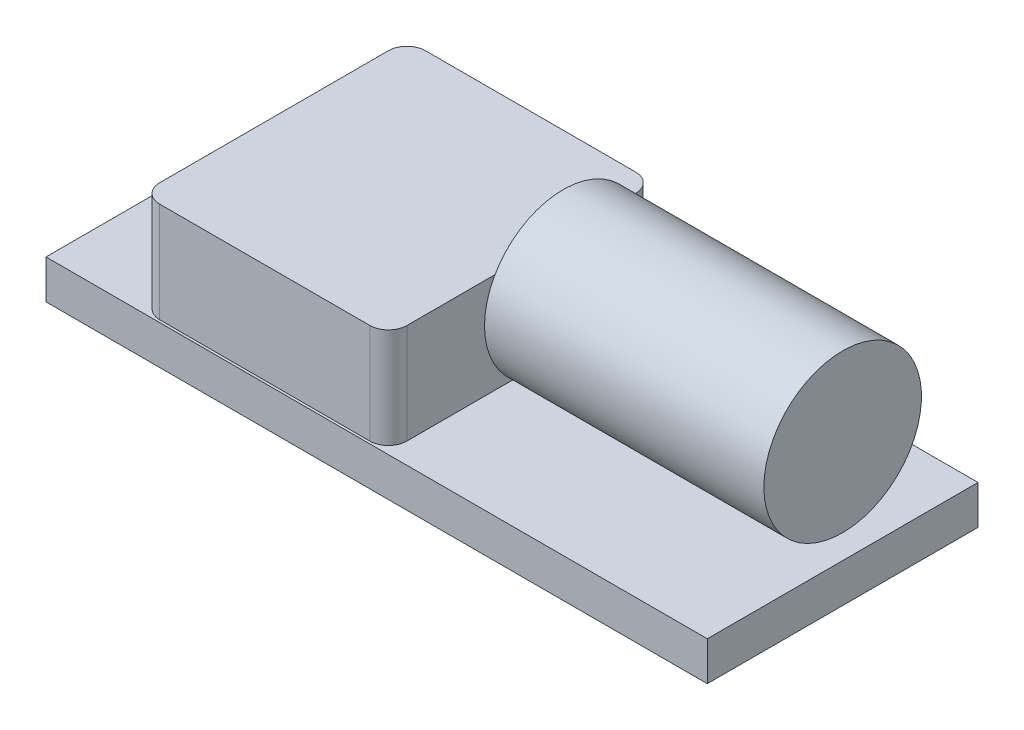
ISO-10303-21;
HEADER;
FILE_DESCRIPTION(('STEP AP214'),'2;1');
FILE_NAME('part.step','',(''),(''),'','','');
FILE_SCHEMA(('AUTOMOTIVE_DESIGN { 1 0 10303 214 1 1 1 1 }'));
ENDSEC;
DATA;
#1=APPLICATION_CONTEXT('core data for automotive mechanical design processes');
#2=APPLICATION_PROTOCOL_DEFINITION('international standard','automotive_design',2000,#1);
#3=PRODUCT_CONTEXT('',#1,'mechanical');
#4=PRODUCT('Part','Part','',(#3));
#5=PRODUCT_RELATED_PRODUCT_CATEGORY('part','',(#4));
#6=PRODUCT_DEFINITION_FORMATION('','',#4);
#7=PRODUCT_DEFINITION_CONTEXT('part definition',#1,'design');
#8=PRODUCT_DEFINITION('design','',#6,#7);
#9=PRODUCT_DEFINITION_SHAPE('','',#8);
#10=(LENGTH_UNIT() NAMED_UNIT(*) SI_UNIT(.MILLI.,.METRE.));
#11=(NAMED_UNIT(*) PLANE_ANGLE_UNIT() SI_UNIT($,.RADIAN.));
#12=(NAMED_UNIT(*) SI_UNIT($,.STERADIAN.) SOLID_ANGLE_UNIT());
#13=UNCERTAINTY_MEASURE_WITH_UNIT(LENGTH_MEASURE(1.E-05),#10,'distance_accuracy_value','');
#14=(GEOMETRIC_REPRESENTATION_CONTEXT(3) GLOBAL_UNCERTAINTY_ASSIGNED_CONTEXT((#13)) GLOBAL_UNIT_ASSIGNED_CONTEXT((#10,
#11,#12)) REPRESENTATION_CONTEXT('',''));
#15=CARTESIAN_POINT('',(0.,0.,0.));
#16=DIRECTION('',(0.,0.,1.));
#17=DIRECTION('',(1.,0.,0.));
#18=AXIS2_PLACEMENT_3D('',#15,#16,#17);
#19=CARTESIAN_POINT('',(13.589,4.2291,0.));
#20=DIRECTION('',(-1.,0.,0.));
#21=DIRECTION('',(0.,0.,1.));
#22=AXIS2_PLACEMENT_3D('',#19,#20,#21);
#23=PLANE('',#22);
#24=CARTESIAN_POINT('',(13.589,4.2291,0.));
#25=DIRECTION('',(-1.,0.,0.));
#26=DIRECTION('',(0.,0.,1.));
#27=AXIS2_PLACEMENT_3D('',#24,#25,#26);
#28=CIRCLE('',#27,3.2385);
#29=CARTESIAN_POINT('',(13.589,4.2291,3.2385));
#30=VERTEX_POINT('',#29);
#31=EDGE_CURVE('E60',#30,#30,#28,.T.);
#32=ORIENTED_EDGE('',*,*,#31,.F.);
#33=EDGE_LOOP('',(#32));
#34=FACE_BOUND('',#33,.T.);
#35=ADVANCED_FACE('F51',(#34),#23,.F.);
#36=CARTESIAN_POINT('',(2.1082,4.2291,0.));
#37=DIRECTION('',(1.,0.,0.));
#38=DIRECTION('',(0.,0.,-1.));
#39=AXIS2_PLACEMENT_3D('',#36,#37,#38);
#40=PLANE('',#39);
#41=CARTESIAN_POINT('',(2.1082,4.2291,0.));
#42=DIRECTION('',(-1.,0.,0.));
#43=DIRECTION('',(0.,0.,1.));
#44=AXIS2_PLACEMENT_3D('',#41,#42,#43);
#45=CIRCLE('',#44,3.2385);
#46=CARTESIAN_POINT('',(2.1082,4.2291,3.2385));
#47=VERTEX_POINT('',#46);
#48=EDGE_CURVE('E11',#47,#47,#45,.T.);
#49=ORIENTED_EDGE('',*,*,#48,.T.);
#50=EDGE_LOOP('',(#49));
#51=FACE_BOUND('',#50,.T.);
#52=ADVANCED_FACE('F66',(#51),#40,.F.);
#53=CARTESIAN_POINT('',(2.1082,4.2291,0.));
#54=DIRECTION('',(-1.,0.,0.));
#55=DIRECTION('',(0.,0.,1.));
#56=AXIS2_PLACEMENT_3D('',#53,#54,#55);
#57=CYLINDRICAL_SURFACE('',#56,3.2385);
#58=ORIENTED_EDGE('',*,*,#48,.F.);
#59=EDGE_LOOP('',(#58));
#60=FACE_BOUND('',#59,.T.);
#61=ORIENTED_EDGE('',*,*,#31,.T.);
#62=EDGE_LOOP('',(#61));
#63=FACE_BOUND('',#62,.T.);
#64=ADVANCED_FACE('F64',(#60,#63),#57,.T.);
#65=CLOSED_SHELL('',(#35,#52,#64));
#66=MANIFOLD_SOLID_BREP('B2',#65);
#67=CARTESIAN_POINT('',(0.,0.,0.));
#68=DIRECTION('',(0.,-1.,0.));
#69=DIRECTION('',(0.,0.,-1.));
#70=AXIS2_PLACEMENT_3D('',#67,#68,#69);
#71=PLANE('',#70);
#72=DIRECTION('',(0.,0.,-1.));
#73=VECTOR('',#72,1.);
#74=CARTESIAN_POINT('',(13.589,0.,5.5626));
#75=LINE('',#74,#73);
#76=CARTESIAN_POINT('',(13.589,0.,5.5626));
#77=VERTEX_POINT('',#76);
#78=CARTESIAN_POINT('',(13.589,0.,-5.5626));
#79=VERTEX_POINT('',#78);
#80=EDGE_CURVE('E212',#77,#79,#75,.T.);
#81=ORIENTED_EDGE('',*,*,#80,.T.);
#82=DIRECTION('',(-1.,0.,0.));
#83=VECTOR('',#82,1.);
#84=CARTESIAN_POINT('',(-13.589,0.,-5.5626));
#85=LINE('',#84,#83);
#86=CARTESIAN_POINT('',(-13.589,0.,-5.5626));
#87=VERTEX_POINT('',#86);
#88=EDGE_CURVE('E220',#79,#87,#85,.T.);
#89=ORIENTED_EDGE('',*,*,#88,.T.);
#90=DIRECTION('',(0.,0.,1.));
#91=VECTOR('',#90,1.);
#92=CARTESIAN_POINT('',(-13.589,0.,5.5626));
#93=LINE('',#92,#91);
#94=CARTESIAN_POINT('',(-13.589,0.,5.5626));
#95=VERTEX_POINT('',#94);
#96=EDGE_CURVE('E236',#87,#95,#93,.T.);
#97=ORIENTED_EDGE('',*,*,#96,.T.);
#98=DIRECTION('',(1.,0.,0.));
#99=VECTOR('',#98,1.);
#100=CARTESIAN_POINT('',(-13.589,0.,5.5626));
#101=LINE('',#100,#99);
#102=EDGE_CURVE('E230',#95,#77,#101,.T.);
#103=ORIENTED_EDGE('',*,*,#102,.T.);
#104=EDGE_LOOP('',(#81,#89,#97,#103));
#105=FACE_BOUND('',#104,.T.);
#106=CARTESIAN_POINT('',(-0.381000000000004,0.,-4.699));
#107=DIRECTION('',(0.,1.,0.));
#108=DIRECTION('',(0.,0.,-1.));
#109=AXIS2_PLACEMENT_3D('',#106,#107,#108);
#110=CIRCLE('',#109,0.762);
#111=CARTESIAN_POINT('',(0.380999999999996,0.,-4.69899999999999));
#112=VERTEX_POINT('',#111);
#113=CARTESIAN_POINT('',(-0.381000000000009,0.,-5.461));
#114=VERTEX_POINT('',#113);
#115=EDGE_CURVE('E121',#112,#114,#110,.T.);
#116=ORIENTED_EDGE('',*,*,#115,.F.);
#117=DIRECTION('',(0.,0.,-1.));
#118=VECTOR('',#117,1.);
#119=CARTESIAN_POINT('',(0.380999999999996,0.,4.69899999999999));
#120=LINE('',#119,#118);
#121=CARTESIAN_POINT('',(0.380999999999996,0.,4.69899999999999));
#122=VERTEX_POINT('',#121);
#123=EDGE_CURVE('E124',#122,#112,#120,.T.);
#124=ORIENTED_EDGE('',*,*,#123,.F.);
#125=CARTESIAN_POINT('',(-0.381000000000004,0.,4.699));
#126=DIRECTION('',(0.,1.,0.));
#127=DIRECTION('',(0.,0.,-1.));
#128=AXIS2_PLACEMENT_3D('',#125,#126,#127);
#129=CIRCLE('',#128,0.762);
#130=CARTESIAN_POINT('',(-0.381000000000009,0.,5.461));
#131=VERTEX_POINT('',#130);
#132=EDGE_CURVE('E457',#131,#122,#129,.T.);
#133=ORIENTED_EDGE('',*,*,#132,.F.);
#134=DIRECTION('',(1.,0.,0.));
#135=VECTOR('',#134,1.);
#136=CARTESIAN_POINT('',(-9.017,0.,5.461));
#137=LINE('',#136,#135);
#138=CARTESIAN_POINT('',(-9.017,0.,5.461));
#139=VERTEX_POINT('',#138);
#140=EDGE_CURVE('E489',#139,#131,#137,.T.);
#141=ORIENTED_EDGE('',*,*,#140,.F.);
#142=CARTESIAN_POINT('',(-9.017,0.,4.699));
#143=DIRECTION('',(0.,1.,0.));
#144=DIRECTION('',(0.,0.,-1.));
#145=AXIS2_PLACEMENT_3D('',#142,#143,#144);
#146=CIRCLE('',#145,0.762);
#147=CARTESIAN_POINT('',(-9.77900000000001,0.,4.69899999999999));
#148=VERTEX_POINT('',#147);
#149=EDGE_CURVE('E483',#148,#139,#146,.T.);
#150=ORIENTED_EDGE('',*,*,#149,.F.);
#151=DIRECTION('',(0.,0.,1.));
#152=VECTOR('',#151,1.);
#153=CARTESIAN_POINT('',(-9.77900000000001,0.,4.69899999999999));
#154=LINE('',#153,#152);
#155=CARTESIAN_POINT('',(-9.77900000000001,0.,-4.69899999999999));
#156=VERTEX_POINT('',#155);
#157=EDGE_CURVE('E480',#156,#148,#154,.T.);
#158=ORIENTED_EDGE('',*,*,#157,.F.);
#159=CARTESIAN_POINT('',(-9.017,0.,-4.699));
#160=DIRECTION('',(0.,1.,0.));
#161=DIRECTION('',(0.,0.,-1.));
#162=AXIS2_PLACEMENT_3D('',#159,#160,#161);
#163=CIRCLE('',#162,0.762);
#164=CARTESIAN_POINT('',(-9.017,0.,-5.461));
#165=VERTEX_POINT('',#164);
#166=EDGE_CURVE('E477',#165,#156,#163,.T.);
#167=ORIENTED_EDGE('',*,*,#166,.F.);
#168=DIRECTION('',(-1.,0.,0.));
#169=VECTOR('',#168,1.);
#170=CARTESIAN_POINT('',(-9.017,0.,-5.461));
#171=LINE('',#170,#169);
#172=EDGE_CURVE('E481',#114,#165,#171,.T.);
#173=ORIENTED_EDGE('',*,*,#172,.F.);
#174=EDGE_LOOP('',(#116,#124,#133,#141,#150,#158,#167,#173));
#175=FACE_BOUND('',#174,.T.);
#176=ADVANCED_FACE('F102',(#105,#175),#71,.F.);
#177=CARTESIAN_POINT('',(13.589,-1.6002,5.5626));
#178=DIRECTION('',(1.,0.,0.));
#179=DIRECTION('',(0.,0.,-1.));
#180=AXIS2_PLACEMENT_3D('',#177,#178,#179);
#181=PLANE('',#180);
#182=ORIENTED_EDGE('',*,*,#80,.F.);
#183=DIRECTION('',(0.,1.,0.));
#184=VECTOR('',#183,1.);
#185=CARTESIAN_POINT('',(13.589,-1.6002,5.5626));
#186=LINE('',#185,#184);
#187=CARTESIAN_POINT('',(13.589,-1.6002,5.5626));
#188=VERTEX_POINT('',#187);
#189=EDGE_CURVE('E47',#188,#77,#186,.T.);
#190=ORIENTED_EDGE('',*,*,#189,.F.);
#191=DIRECTION('',(0.,0.,-1.));
#192=VECTOR('',#191,1.);
#193=CARTESIAN_POINT('',(13.589,-1.6002,5.5626));
#194=LINE('',#193,#192);
#195=CARTESIAN_POINT('',(13.589,-1.6002,-5.5626));
#196=VERTEX_POINT('',#195);
#197=EDGE_CURVE('E224',#188,#196,#194,.T.);
#198=ORIENTED_EDGE('',*,*,#197,.T.);
#199=DIRECTION('',(0.,1.,0.));
#200=VECTOR('',#199,1.);
#201=CARTESIAN_POINT('',(13.589,-1.6002,-5.5626));
#202=LINE('',#201,#200);
#203=EDGE_CURVE('E107',#196,#79,#202,.T.);
#204=ORIENTED_EDGE('',*,*,#203,.T.);
#205=EDGE_LOOP('',(#182,#190,#198,#204));
#206=FACE_BOUND('',#205,.T.);
#207=ADVANCED_FACE('F106',(#206),#181,.T.);
#208=CARTESIAN_POINT('',(-13.589,-1.6002,5.5626));
#209=DIRECTION('',(0.,0.,1.));
#210=DIRECTION('',(1.,0.,0.));
#211=AXIS2_PLACEMENT_3D('',#208,#209,#210);
#212=PLANE('',#211);
#213=ORIENTED_EDGE('',*,*,#102,.F.);
#214=DIRECTION('',(0.,1.,0.));
#215=VECTOR('',#214,1.);
#216=CARTESIAN_POINT('',(-13.589,-1.6002,5.5626));
#217=LINE('',#216,#215);
#218=CARTESIAN_POINT('',(-13.589,-1.6002,5.5626));
#219=VERTEX_POINT('',#218);
#220=EDGE_CURVE('E114',#219,#95,#217,.T.);
#221=ORIENTED_EDGE('',*,*,#220,.F.);
#222=DIRECTION('',(1.,0.,0.));
#223=VECTOR('',#222,1.);
#224=CARTESIAN_POINT('',(-13.589,-1.6002,5.5626));
#225=LINE('',#224,#223);
#226=EDGE_CURVE('E232',#219,#188,#225,.T.);
#227=ORIENTED_EDGE('',*,*,#226,.T.);
#228=ORIENTED_EDGE('',*,*,#189,.T.);
#229=EDGE_LOOP('',(#213,#221,#227,#228));
#230=FACE_BOUND('',#229,.T.);
#231=ADVANCED_FACE('F254',(#230),#212,.T.);
#232=CARTESIAN_POINT('',(-13.589,-1.6002,5.5626));
#233=DIRECTION('',(-1.,0.,0.));
#234=DIRECTION('',(0.,0.,1.));
#235=AXIS2_PLACEMENT_3D('',#232,#233,#234);
#236=PLANE('',#235);
#237=ORIENTED_EDGE('',*,*,#96,.F.);
#238=DIRECTION('',(0.,1.,0.));
#239=VECTOR('',#238,1.);
#240=CARTESIAN_POINT('',(-13.589,-1.6002,-5.5626));
#241=LINE('',#240,#239);
#242=CARTESIAN_POINT('',(-13.589,-1.6002,-5.5626));
#243=VERTEX_POINT('',#242);
#244=EDGE_CURVE('E244',#243,#87,#241,.T.);
#245=ORIENTED_EDGE('',*,*,#244,.F.);
#246=DIRECTION('',(0.,0.,1.));
#247=VECTOR('',#246,1.);
#248=CARTESIAN_POINT('',(-13.589,-1.6002,5.5626));
#249=LINE('',#248,#247);
#250=EDGE_CURVE('E228',#243,#219,#249,.T.);
#251=ORIENTED_EDGE('',*,*,#250,.T.);
#252=ORIENTED_EDGE('',*,*,#220,.T.);
#253=EDGE_LOOP('',(#237,#245,#251,#252));
#254=FACE_BOUND('',#253,.T.);
#255=ADVANCED_FACE('F261',(#254),#236,.T.);
#256=CARTESIAN_POINT('',(-13.589,-1.6002,-5.5626));
#257=DIRECTION('',(0.,0.,-1.));
#258=DIRECTION('',(-1.,0.,0.));
#259=AXIS2_PLACEMENT_3D('',#256,#257,#258);
#260=PLANE('',#259);
#261=ORIENTED_EDGE('',*,*,#88,.F.);
#262=ORIENTED_EDGE('',*,*,#203,.F.);
#263=DIRECTION('',(-1.,0.,0.));
#264=VECTOR('',#263,1.);
#265=CARTESIAN_POINT('',(-13.589,-1.6002,-5.5626));
#266=LINE('',#265,#264);
#267=EDGE_CURVE('E227',#196,#243,#266,.T.);
#268=ORIENTED_EDGE('',*,*,#267,.T.);
#269=ORIENTED_EDGE('',*,*,#244,.T.);
#270=EDGE_LOOP('',(#261,#262,#268,#269));
#271=FACE_BOUND('',#270,.T.);
#272=ADVANCED_FACE('F253',(#271),#260,.T.);
#273=CARTESIAN_POINT('',(0.,-1.6002,0.));
#274=DIRECTION('',(0.,-1.,0.));
#275=DIRECTION('',(0.,0.,-1.));
#276=AXIS2_PLACEMENT_3D('',#273,#274,#275);
#277=PLANE('',#276);
#278=ORIENTED_EDGE('',*,*,#197,.F.);
#279=ORIENTED_EDGE('',*,*,#226,.F.);
#280=ORIENTED_EDGE('',*,*,#250,.F.);
#281=ORIENTED_EDGE('',*,*,#267,.F.);
#282=EDGE_LOOP('',(#278,#279,#280,#281));
#283=FACE_BOUND('',#282,.T.);
#284=ADVANCED_FACE('F256',(#283),#277,.T.);
#285=CARTESIAN_POINT('',(-0.381000000000004,4.1148,-4.699));
#286=DIRECTION('',(0.,-1.,0.));
#287=DIRECTION('',(0.,0.,-1.));
#288=AXIS2_PLACEMENT_3D('',#285,#286,#287);
#289=CYLINDRICAL_SURFACE('',#288,0.762);
#290=ORIENTED_EDGE('',*,*,#115,.T.);
#291=DIRECTION('',(0.,-1.,0.));
#292=VECTOR('',#291,1.);
#293=CARTESIAN_POINT('',(-0.381000000000009,4.1148,-5.461));
#294=LINE('',#293,#292);
#295=CARTESIAN_POINT('',(-0.381000000000009,4.1148,-5.461));
#296=VERTEX_POINT('',#295);
#297=EDGE_CURVE('E197',#296,#114,#294,.T.);
#298=ORIENTED_EDGE('',*,*,#297,.F.);
#299=CARTESIAN_POINT('',(-0.381000000000004,4.1148,-4.699));
#300=DIRECTION('',(0.,1.,0.));
#301=DIRECTION('',(0.,0.,-1.));
#302=AXIS2_PLACEMENT_3D('',#299,#300,#301);
#303=CIRCLE('',#302,0.762);
#304=CARTESIAN_POINT('',(0.380999999999996,4.1148,-4.69899999999999));
#305=VERTEX_POINT('',#304);
#306=EDGE_CURVE('E201',#305,#296,#303,.T.);
#307=ORIENTED_EDGE('',*,*,#306,.F.);
#308=DIRECTION('',(0.,-1.,0.));
#309=VECTOR('',#308,1.);
#310=CARTESIAN_POINT('',(0.380999999999996,4.1148,-4.69899999999999));
#311=LINE('',#310,#309);
#312=EDGE_CURVE('E452',#305,#112,#311,.T.);
#313=ORIENTED_EDGE('',*,*,#312,.T.);
#314=EDGE_LOOP('',(#290,#298,#307,#313));
#315=FACE_BOUND('',#314,.T.);
#316=ADVANCED_FACE('F213',(#315),#289,.T.);
#317=CARTESIAN_POINT('',(-9.017,4.1148,-5.461));
#318=DIRECTION('',(0.,0.,1.));
#319=DIRECTION('',(1.,0.,0.));
#320=AXIS2_PLACEMENT_3D('',#317,#318,#319);
#321=PLANE('',#320);
#322=ORIENTED_EDGE('',*,*,#172,.T.);
#323=DIRECTION('',(0.,-1.,0.));
#324=VECTOR('',#323,1.);
#325=CARTESIAN_POINT('',(-9.017,4.1148,-5.461));
#326=LINE('',#325,#324);
#327=CARTESIAN_POINT('',(-9.017,4.1148,-5.461));
#328=VERTEX_POINT('',#327);
#329=EDGE_CURVE('E200',#328,#165,#326,.T.);
#330=ORIENTED_EDGE('',*,*,#329,.F.);
#331=DIRECTION('',(-1.,0.,0.));
#332=VECTOR('',#331,1.);
#333=CARTESIAN_POINT('',(-9.017,4.1148,-5.461));
#334=LINE('',#333,#332);
#335=EDGE_CURVE('E195',#296,#328,#334,.T.);
#336=ORIENTED_EDGE('',*,*,#335,.F.);
#337=ORIENTED_EDGE('',*,*,#297,.T.);
#338=EDGE_LOOP('',(#322,#330,#336,#337));
#339=FACE_BOUND('',#338,.T.);
#340=ADVANCED_FACE('F194',(#339),#321,.F.);
#341=CARTESIAN_POINT('',(-9.017,4.1148,-4.699));
#342=DIRECTION('',(0.,-1.,0.));
#343=DIRECTION('',(0.,0.,-1.));
#344=AXIS2_PLACEMENT_3D('',#341,#342,#343);
#345=CYLINDRICAL_SURFACE('',#344,0.762);
#346=ORIENTED_EDGE('',*,*,#166,.T.);
#347=DIRECTION('',(0.,-1.,0.));
#348=VECTOR('',#347,1.);
#349=CARTESIAN_POINT('',(-9.77900000000001,4.1148,-4.69899999999999));
#350=LINE('',#349,#348);
#351=CARTESIAN_POINT('',(-9.77900000000001,4.1148,-4.69899999999999));
#352=VERTEX_POINT('',#351);
#353=EDGE_CURVE('E218',#352,#156,#350,.T.);
#354=ORIENTED_EDGE('',*,*,#353,.F.);
#355=CARTESIAN_POINT('',(-9.017,4.1148,-4.699));
#356=DIRECTION('',(0.,1.,0.));
#357=DIRECTION('',(0.,0.,-1.));
#358=AXIS2_PLACEMENT_3D('',#355,#356,#357);
#359=CIRCLE('',#358,0.762);
#360=EDGE_CURVE('E205',#328,#352,#359,.T.);
#361=ORIENTED_EDGE('',*,*,#360,.F.);
#362=ORIENTED_EDGE('',*,*,#329,.T.);
#363=EDGE_LOOP('',(#346,#354,#361,#362));
#364=FACE_BOUND('',#363,.T.);
#365=ADVANCED_FACE('F282',(#364),#345,.T.);
#366=CARTESIAN_POINT('',(-9.77900000000001,4.1148,4.69899999999999));
#367=DIRECTION('',(1.,0.,0.));
#368=DIRECTION('',(0.,0.,-1.));
#369=AXIS2_PLACEMENT_3D('',#366,#367,#368);
#370=PLANE('',#369);
#371=ORIENTED_EDGE('',*,*,#157,.T.);
#372=DIRECTION('',(0.,-1.,0.));
#373=VECTOR('',#372,1.);
#374=CARTESIAN_POINT('',(-9.77900000000001,4.1148,4.69899999999999));
#375=LINE('',#374,#373);
#376=CARTESIAN_POINT('',(-9.77900000000001,4.1148,4.69899999999999));
#377=VERTEX_POINT('',#376);
#378=EDGE_CURVE('E469',#377,#148,#375,.T.);
#379=ORIENTED_EDGE('',*,*,#378,.F.);
#380=DIRECTION('',(0.,0.,1.));
#381=VECTOR('',#380,1.);
#382=CARTESIAN_POINT('',(-9.77900000000001,4.1148,4.69899999999999));
#383=LINE('',#382,#381);
#384=EDGE_CURVE('E476',#352,#377,#383,.T.);
#385=ORIENTED_EDGE('',*,*,#384,.F.);
#386=ORIENTED_EDGE('',*,*,#353,.T.);
#387=EDGE_LOOP('',(#371,#379,#385,#386));
#388=FACE_BOUND('',#387,.T.);
#389=ADVANCED_FACE('F281',(#388),#370,.F.);
#390=CARTESIAN_POINT('',(-9.017,4.1148,4.699));
#391=DIRECTION('',(0.,-1.,0.));
#392=DIRECTION('',(0.,0.,-1.));
#393=AXIS2_PLACEMENT_3D('',#390,#391,#392);
#394=CYLINDRICAL_SURFACE('',#393,0.762);
#395=ORIENTED_EDGE('',*,*,#149,.T.);
#396=DIRECTION('',(0.,-1.,0.));
#397=VECTOR('',#396,1.);
#398=CARTESIAN_POINT('',(-9.017,4.1148,5.461));
#399=LINE('',#398,#397);
#400=CARTESIAN_POINT('',(-9.017,4.1148,5.461));
#401=VERTEX_POINT('',#400);
#402=EDGE_CURVE('E470',#401,#139,#399,.T.);
#403=ORIENTED_EDGE('',*,*,#402,.F.);
#404=CARTESIAN_POINT('',(-9.017,4.1148,4.699));
#405=DIRECTION('',(0.,1.,0.));
#406=DIRECTION('',(0.,0.,-1.));
#407=AXIS2_PLACEMENT_3D('',#404,#405,#406);
#408=CIRCLE('',#407,0.762);
#409=EDGE_CURVE('E499',#377,#401,#408,.T.);
#410=ORIENTED_EDGE('',*,*,#409,.F.);
#411=ORIENTED_EDGE('',*,*,#378,.T.);
#412=EDGE_LOOP('',(#395,#403,#410,#411));
#413=FACE_BOUND('',#412,.T.);
#414=ADVANCED_FACE('F287',(#413),#394,.T.);
#415=CARTESIAN_POINT('',(-9.017,4.1148,5.461));
#416=DIRECTION('',(0.,0.,-1.));
#417=DIRECTION('',(-1.,0.,0.));
#418=AXIS2_PLACEMENT_3D('',#415,#416,#417);
#419=PLANE('',#418);
#420=ORIENTED_EDGE('',*,*,#140,.T.);
#421=DIRECTION('',(0.,-1.,0.));
#422=VECTOR('',#421,1.);
#423=CARTESIAN_POINT('',(-0.381000000000009,4.1148,5.461));
#424=LINE('',#423,#422);
#425=CARTESIAN_POINT('',(-0.381000000000009,4.1148,5.461));
#426=VERTEX_POINT('',#425);
#427=EDGE_CURVE('E459',#426,#131,#424,.T.);
#428=ORIENTED_EDGE('',*,*,#427,.F.);
#429=DIRECTION('',(1.,0.,0.));
#430=VECTOR('',#429,1.);
#431=CARTESIAN_POINT('',(-9.017,4.1148,5.461));
#432=LINE('',#431,#430);
#433=EDGE_CURVE('E497',#401,#426,#432,.T.);
#434=ORIENTED_EDGE('',*,*,#433,.F.);
#435=ORIENTED_EDGE('',*,*,#402,.T.);
#436=EDGE_LOOP('',(#420,#428,#434,#435));
#437=FACE_BOUND('',#436,.T.);
#438=ADVANCED_FACE('F295',(#437),#419,.F.);
#439=CARTESIAN_POINT('',(-0.381000000000004,4.1148,4.699));
#440=DIRECTION('',(0.,-1.,0.));
#441=DIRECTION('',(0.,0.,-1.));
#442=AXIS2_PLACEMENT_3D('',#439,#440,#441);
#443=CYLINDRICAL_SURFACE('',#442,0.762);
#444=ORIENTED_EDGE('',*,*,#132,.T.);
#445=DIRECTION('',(0.,-1.,0.));
#446=VECTOR('',#445,1.);
#447=CARTESIAN_POINT('',(0.380999999999996,4.1148,4.69899999999999));
#448=LINE('',#447,#446);
#449=CARTESIAN_POINT('',(0.380999999999996,4.1148,4.69899999999999));
#450=VERTEX_POINT('',#449);
#451=EDGE_CURVE('E454',#450,#122,#448,.T.);
#452=ORIENTED_EDGE('',*,*,#451,.F.);
#453=CARTESIAN_POINT('',(-0.381000000000004,4.1148,4.699));
#454=DIRECTION('',(0.,1.,0.));
#455=DIRECTION('',(0.,0.,-1.));
#456=AXIS2_PLACEMENT_3D('',#453,#454,#455);
#457=CIRCLE('',#456,0.762);
#458=EDGE_CURVE('E462',#426,#450,#457,.T.);
#459=ORIENTED_EDGE('',*,*,#458,.F.);
#460=ORIENTED_EDGE('',*,*,#427,.T.);
#461=EDGE_LOOP('',(#444,#452,#459,#460));
#462=FACE_BOUND('',#461,.T.);
#463=ADVANCED_FACE('F297',(#462),#443,.T.);
#464=CARTESIAN_POINT('',(0.380999999999996,4.1148,4.69899999999999));
#465=DIRECTION('',(-1.,0.,0.));
#466=DIRECTION('',(0.,0.,1.));
#467=AXIS2_PLACEMENT_3D('',#464,#465,#466);
#468=PLANE('',#467);
#469=ORIENTED_EDGE('',*,*,#123,.T.);
#470=ORIENTED_EDGE('',*,*,#312,.F.);
#471=DIRECTION('',(0.,0.,-1.));
#472=VECTOR('',#471,1.);
#473=CARTESIAN_POINT('',(0.380999999999996,4.1148,4.69899999999999));
#474=LINE('',#473,#472);
#475=EDGE_CURVE('E208',#450,#305,#474,.T.);
#476=ORIENTED_EDGE('',*,*,#475,.F.);
#477=ORIENTED_EDGE('',*,*,#451,.T.);
#478=EDGE_LOOP('',(#469,#470,#476,#477));
#479=FACE_BOUND('',#478,.T.);
#480=ADVANCED_FACE('F298',(#479),#468,.F.);
#481=CARTESIAN_POINT('',(-0.381000000000004,4.1148,-4.699));
#482=DIRECTION('',(0.,-1.,0.));
#483=DIRECTION('',(0.,0.,-1.));
#484=AXIS2_PLACEMENT_3D('',#481,#482,#483);
#485=PLANE('',#484);
#486=ORIENTED_EDGE('',*,*,#306,.T.);
#487=ORIENTED_EDGE('',*,*,#335,.T.);
#488=ORIENTED_EDGE('',*,*,#360,.T.);
#489=ORIENTED_EDGE('',*,*,#384,.T.);
#490=ORIENTED_EDGE('',*,*,#409,.T.);
#491=ORIENTED_EDGE('',*,*,#433,.T.);
#492=ORIENTED_EDGE('',*,*,#458,.T.);
#493=ORIENTED_EDGE('',*,*,#475,.T.);
#494=EDGE_LOOP('',(#486,#487,#488,#489,#490,#491,#492,#493));
#495=FACE_BOUND('',#494,.T.);
#496=ADVANCED_FACE('F206',(#495),#485,.F.);
#497=CLOSED_SHELL('',(#176,#207,#231,#255,#272,#284,#316,#340,#365,#389,#414,#438,#463,#480,#496));
#498=MANIFOLD_SOLID_BREP('B6',#497);
#499=ADVANCED_BREP_SHAPE_REPRESENTATION('',(#18,#66,#498),#14);
#500=SHAPE_DEFINITION_REPRESENTATION(#9,#499);
ENDSEC;
END-ISO-10303-21;
